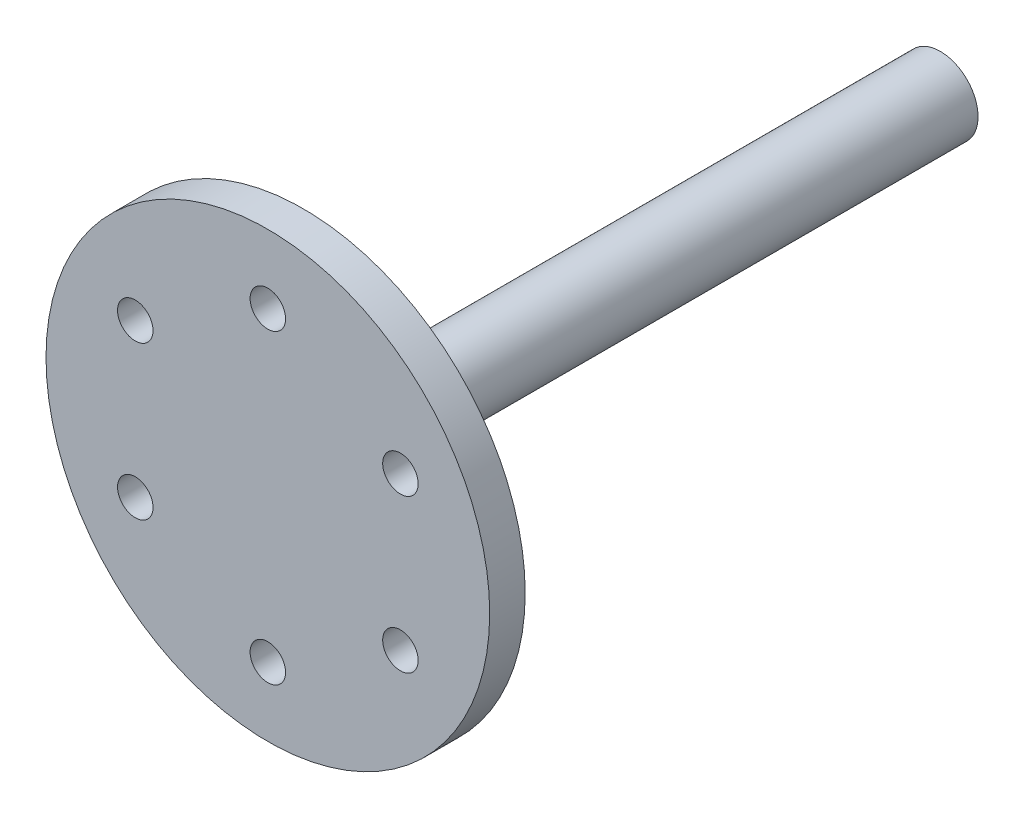
ISO-10303-21;
HEADER;
FILE_DESCRIPTION(('STEP AP214'),'2;1');
FILE_NAME('part.step','',(''),(''),'','','');
FILE_SCHEMA(('AUTOMOTIVE_DESIGN { 1 0 10303 214 1 1 1 1 }'));
ENDSEC;
DATA;
#1=APPLICATION_CONTEXT('core data for automotive mechanical design processes');
#2=APPLICATION_PROTOCOL_DEFINITION('international standard','automotive_design',2000,#1);
#3=PRODUCT_CONTEXT('',#1,'mechanical');
#4=PRODUCT('Part','Part','',(#3));
#5=PRODUCT_RELATED_PRODUCT_CATEGORY('part','',(#4));
#6=PRODUCT_DEFINITION_FORMATION('','',#4);
#7=PRODUCT_DEFINITION_CONTEXT('part definition',#1,'design');
#8=PRODUCT_DEFINITION('design','',#6,#7);
#9=PRODUCT_DEFINITION_SHAPE('','',#8);
#10=(LENGTH_UNIT() NAMED_UNIT(*) SI_UNIT(.MILLI.,.METRE.));
#11=(NAMED_UNIT(*) PLANE_ANGLE_UNIT() SI_UNIT($,.RADIAN.));
#12=(NAMED_UNIT(*) SI_UNIT($,.STERADIAN.) SOLID_ANGLE_UNIT());
#13=UNCERTAINTY_MEASURE_WITH_UNIT(LENGTH_MEASURE(1.E-05),#10,'distance_accuracy_value','');
#14=(GEOMETRIC_REPRESENTATION_CONTEXT(3) GLOBAL_UNCERTAINTY_ASSIGNED_CONTEXT((#13)) GLOBAL_UNIT_ASSIGNED_CONTEXT((#10,
#11,#12)) REPRESENTATION_CONTEXT('',''));
#15=CARTESIAN_POINT('',(0.,0.,0.));
#16=DIRECTION('',(0.,0.,1.));
#17=DIRECTION('',(1.,0.,0.));
#18=AXIS2_PLACEMENT_3D('',#15,#16,#17);
#19=CARTESIAN_POINT('',(0.,0.,4.));
#20=DIRECTION('',(0.,0.,-1.));
#21=DIRECTION('',(-1.,0.,0.));
#22=AXIS2_PLACEMENT_3D('',#19,#20,#21);
#23=CYLINDRICAL_SURFACE('',#22,25.);
#24=CARTESIAN_POINT('',(0.,0.,4.));
#25=DIRECTION('',(0.,0.,1.));
#26=DIRECTION('',(1.,0.,0.));
#27=AXIS2_PLACEMENT_3D('',#24,#25,#26);
#28=CIRCLE('',#27,25.);
#29=CARTESIAN_POINT('',(25.,0.,4.));
#30=VERTEX_POINT('',#29);
#31=EDGE_CURVE('E51',#30,#30,#28,.T.);
#32=ORIENTED_EDGE('',*,*,#31,.F.);
#33=EDGE_LOOP('',(#32));
#34=FACE_BOUND('',#33,.T.);
#35=CARTESIAN_POINT('',(0.,0.,0.));
#36=DIRECTION('',(0.,0.,1.));
#37=DIRECTION('',(1.,0.,0.));
#38=AXIS2_PLACEMENT_3D('',#35,#36,#37);
#39=CIRCLE('',#38,25.);
#40=CARTESIAN_POINT('',(25.,0.,0.));
#41=VERTEX_POINT('',#40);
#42=EDGE_CURVE('E46',#41,#41,#39,.T.);
#43=ORIENTED_EDGE('',*,*,#42,.T.);
#44=EDGE_LOOP('',(#43));
#45=FACE_BOUND('',#44,.T.);
#46=ADVANCED_FACE('F43',(#34,#45),#23,.T.);
#47=CARTESIAN_POINT('',(0.,0.,4.));
#48=DIRECTION('',(0.,0.,1.));
#49=DIRECTION('',(1.,0.,0.));
#50=AXIS2_PLACEMENT_3D('',#47,#48,#49);
#51=PLANE('',#50);
#52=CARTESIAN_POINT('',(0.,17.25,4.));
#53=DIRECTION('',(0.,0.,1.));
#54=DIRECTION('',(1.,0.,0.));
#55=AXIS2_PLACEMENT_3D('',#52,#53,#54);
#56=CIRCLE('',#55,2.);
#57=CARTESIAN_POINT('',(2.,17.25,4.));
#58=VERTEX_POINT('',#57);
#59=EDGE_CURVE('E62',#58,#58,#56,.T.);
#60=ORIENTED_EDGE('',*,*,#59,.F.);
#61=EDGE_LOOP('',(#60));
#62=FACE_BOUND('',#61,.T.);
#63=CARTESIAN_POINT('',(14.9389382152815,8.62500000000018,4.));
#64=DIRECTION('',(0.,0.,1.));
#65=DIRECTION('',(1.,0.,0.));
#66=AXIS2_PLACEMENT_3D('',#63,#64,#65);
#67=CIRCLE('',#66,2.);
#68=CARTESIAN_POINT('',(16.9389382152815,8.62500000000018,4.));
#69=VERTEX_POINT('',#68);
#70=EDGE_CURVE('E66',#69,#69,#67,.T.);
#71=ORIENTED_EDGE('',*,*,#70,.F.);
#72=EDGE_LOOP('',(#71));
#73=FACE_BOUND('',#72,.T.);
#74=CARTESIAN_POINT('',(14.9389382152816,-8.62499999999986,4.));
#75=DIRECTION('',(0.,0.,1.));
#76=DIRECTION('',(1.,0.,0.));
#77=AXIS2_PLACEMENT_3D('',#74,#75,#76);
#78=CIRCLE('',#77,2.);
#79=CARTESIAN_POINT('',(16.9389382152816,-8.62499999999986,4.));
#80=VERTEX_POINT('',#79);
#81=EDGE_CURVE('E70',#80,#80,#78,.T.);
#82=ORIENTED_EDGE('',*,*,#81,.F.);
#83=EDGE_LOOP('',(#82));
#84=FACE_BOUND('',#83,.T.);
#85=CARTESIAN_POINT('',(1.20456106190088E-13,-17.25,4.));
#86=DIRECTION('',(0.,0.,1.));
#87=DIRECTION('',(1.,0.,0.));
#88=AXIS2_PLACEMENT_3D('',#85,#86,#87);
#89=CIRCLE('',#88,2.);
#90=CARTESIAN_POINT('',(2.00000000000012,-17.25,4.));
#91=VERTEX_POINT('',#90);
#92=EDGE_CURVE('E74',#91,#91,#89,.T.);
#93=ORIENTED_EDGE('',*,*,#92,.F.);
#94=EDGE_LOOP('',(#93));
#95=FACE_BOUND('',#94,.T.);
#96=CARTESIAN_POINT('',(-14.9389382152815,-8.62500000000007,4.));
#97=DIRECTION('',(0.,0.,1.));
#98=DIRECTION('',(1.,0.,0.));
#99=AXIS2_PLACEMENT_3D('',#96,#97,#98);
#100=CIRCLE('',#99,2.);
#101=CARTESIAN_POINT('',(-12.9389382152815,-8.62500000000007,4.));
#102=VERTEX_POINT('',#101);
#103=EDGE_CURVE('E78',#102,#102,#100,.T.);
#104=ORIENTED_EDGE('',*,*,#103,.F.);
#105=EDGE_LOOP('',(#104));
#106=FACE_BOUND('',#105,.T.);
#107=CARTESIAN_POINT('',(-14.9389382152816,8.62499999999997,4.));
#108=DIRECTION('',(0.,0.,1.));
#109=DIRECTION('',(1.,0.,0.));
#110=AXIS2_PLACEMENT_3D('',#107,#108,#109);
#111=CIRCLE('',#110,2.);
#112=CARTESIAN_POINT('',(-12.9389382152816,8.62499999999997,4.));
#113=VERTEX_POINT('',#112);
#114=EDGE_CURVE('E82',#113,#113,#111,.T.);
#115=ORIENTED_EDGE('',*,*,#114,.F.);
#116=EDGE_LOOP('',(#115));
#117=FACE_BOUND('',#116,.T.);
#118=ORIENTED_EDGE('',*,*,#31,.T.);
#119=EDGE_LOOP('',(#118));
#120=FACE_BOUND('',#119,.T.);
#121=ADVANCED_FACE('F117',(#62,#73,#84,#95,#106,#117,#120),#51,.T.);
#122=CARTESIAN_POINT('',(0.,0.,0.));
#123=DIRECTION('',(0.,0.,1.));
#124=DIRECTION('',(1.,0.,0.));
#125=AXIS2_PLACEMENT_3D('',#122,#123,#124);
#126=PLANE('',#125);
#127=CARTESIAN_POINT('',(0.,17.25,0.));
#128=DIRECTION('',(0.,0.,-1.));
#129=DIRECTION('',(-1.,0.,0.));
#130=AXIS2_PLACEMENT_3D('',#127,#128,#129);
#131=CIRCLE('',#130,2.);
#132=CARTESIAN_POINT('',(-2.,17.25,0.));
#133=VERTEX_POINT('',#132);
#134=EDGE_CURVE('E86',#133,#133,#131,.T.);
#135=ORIENTED_EDGE('',*,*,#134,.F.);
#136=EDGE_LOOP('',(#135));
#137=FACE_BOUND('',#136,.T.);
#138=CARTESIAN_POINT('',(14.9389382152815,8.62500000000018,0.));
#139=DIRECTION('',(0.,0.,-1.));
#140=DIRECTION('',(-1.,0.,0.));
#141=AXIS2_PLACEMENT_3D('',#138,#139,#140);
#142=CIRCLE('',#141,2.);
#143=CARTESIAN_POINT('',(12.9389382152815,8.62500000000018,0.));
#144=VERTEX_POINT('',#143);
#145=EDGE_CURVE('E92',#144,#144,#142,.T.);
#146=ORIENTED_EDGE('',*,*,#145,.F.);
#147=EDGE_LOOP('',(#146));
#148=FACE_BOUND('',#147,.T.);
#149=CARTESIAN_POINT('',(14.9389382152816,-8.62499999999986,0.));
#150=DIRECTION('',(0.,0.,-1.));
#151=DIRECTION('',(-1.,0.,0.));
#152=AXIS2_PLACEMENT_3D('',#149,#150,#151);
#153=CIRCLE('',#152,2.);
#154=CARTESIAN_POINT('',(12.9389382152816,-8.62499999999986,0.));
#155=VERTEX_POINT('',#154);
#156=EDGE_CURVE('E87',#155,#155,#153,.T.);
#157=ORIENTED_EDGE('',*,*,#156,.F.);
#158=EDGE_LOOP('',(#157));
#159=FACE_BOUND('',#158,.T.);
#160=CARTESIAN_POINT('',(1.20456106190088E-13,-17.25,0.));
#161=DIRECTION('',(0.,0.,-1.));
#162=DIRECTION('',(-1.,0.,0.));
#163=AXIS2_PLACEMENT_3D('',#160,#161,#162);
#164=CIRCLE('',#163,2.);
#165=CARTESIAN_POINT('',(-1.99999999999988,-17.25,0.));
#166=VERTEX_POINT('',#165);
#167=EDGE_CURVE('E91',#166,#166,#164,.T.);
#168=ORIENTED_EDGE('',*,*,#167,.F.);
#169=EDGE_LOOP('',(#168));
#170=FACE_BOUND('',#169,.T.);
#171=CARTESIAN_POINT('',(-14.9389382152815,-8.62500000000007,0.));
#172=DIRECTION('',(0.,0.,-1.));
#173=DIRECTION('',(-1.,0.,0.));
#174=AXIS2_PLACEMENT_3D('',#171,#172,#173);
#175=CIRCLE('',#174,2.);
#176=CARTESIAN_POINT('',(-16.9389382152815,-8.62500000000007,0.));
#177=VERTEX_POINT('',#176);
#178=EDGE_CURVE('E96',#177,#177,#175,.T.);
#179=ORIENTED_EDGE('',*,*,#178,.F.);
#180=EDGE_LOOP('',(#179));
#181=FACE_BOUND('',#180,.T.);
#182=CARTESIAN_POINT('',(-14.9389382152816,8.62499999999997,0.));
#183=DIRECTION('',(0.,0.,-1.));
#184=DIRECTION('',(-1.,0.,0.));
#185=AXIS2_PLACEMENT_3D('',#182,#183,#184);
#186=CIRCLE('',#185,2.);
#187=CARTESIAN_POINT('',(-16.9389382152816,8.62499999999997,0.));
#188=VERTEX_POINT('',#187);
#189=EDGE_CURVE('E100',#188,#188,#186,.T.);
#190=ORIENTED_EDGE('',*,*,#189,.F.);
#191=EDGE_LOOP('',(#190));
#192=FACE_BOUND('',#191,.T.);
#193=CARTESIAN_POINT('',(-0.216871769754295,0.,0.));
#194=DIRECTION('',(0.,0.,-1.));
#195=DIRECTION('',(-1.,0.,0.));
#196=AXIS2_PLACEMENT_3D('',#193,#194,#195);
#197=CIRCLE('',#196,4.25);
#198=CARTESIAN_POINT('',(-4.4668717697543,0.,0.));
#199=VERTEX_POINT('',#198);
#200=EDGE_CURVE('E10',#199,#199,#197,.T.);
#201=ORIENTED_EDGE('',*,*,#200,.F.);
#202=EDGE_LOOP('',(#201));
#203=FACE_BOUND('',#202,.T.);
#204=ORIENTED_EDGE('',*,*,#42,.F.);
#205=EDGE_LOOP('',(#204));
#206=FACE_BOUND('',#205,.T.);
#207=ADVANCED_FACE('F113',(#137,#148,#159,#170,#181,#192,#203,#206),#126,.F.);
#208=CARTESIAN_POINT('',(-0.216871769754295,0.,-72.));
#209=DIRECTION('',(0.,0.,1.));
#210=DIRECTION('',(1.,0.,0.));
#211=AXIS2_PLACEMENT_3D('',#208,#209,#210);
#212=CYLINDRICAL_SURFACE('',#211,4.25);
#213=CARTESIAN_POINT('',(-0.216871769754295,0.,-72.));
#214=DIRECTION('',(0.,0.,-1.));
#215=DIRECTION('',(-1.,0.,0.));
#216=AXIS2_PLACEMENT_3D('',#213,#214,#215);
#217=CIRCLE('',#216,4.25);
#218=CARTESIAN_POINT('',(-4.4668717697543,0.,-72.));
#219=VERTEX_POINT('',#218);
#220=EDGE_CURVE('E58',#219,#219,#217,.T.);
#221=ORIENTED_EDGE('',*,*,#220,.F.);
#222=EDGE_LOOP('',(#221));
#223=FACE_BOUND('',#222,.T.);
#224=ORIENTED_EDGE('',*,*,#200,.T.);
#225=EDGE_LOOP('',(#224));
#226=FACE_BOUND('',#225,.T.);
#227=ADVANCED_FACE('F116',(#223,#226),#212,.T.);
#228=CARTESIAN_POINT('',(-0.216871769754295,0.,-72.));
#229=DIRECTION('',(0.,0.,-1.));
#230=DIRECTION('',(-1.,0.,0.));
#231=AXIS2_PLACEMENT_3D('',#228,#229,#230);
#232=PLANE('',#231);
#233=ORIENTED_EDGE('',*,*,#220,.T.);
#234=EDGE_LOOP('',(#233));
#235=FACE_BOUND('',#234,.T.);
#236=ADVANCED_FACE('F150',(#235),#232,.T.);
#237=CARTESIAN_POINT('',(-14.9389382152816,8.62499999999997,100.));
#238=DIRECTION('',(0.,0.,-1.));
#239=DIRECTION('',(-1.,0.,0.));
#240=AXIS2_PLACEMENT_3D('',#237,#238,#239);
#241=CYLINDRICAL_SURFACE('',#240,2.);
#242=ORIENTED_EDGE('',*,*,#114,.T.);
#243=EDGE_LOOP('',(#242));
#244=FACE_BOUND('',#243,.T.);
#245=ORIENTED_EDGE('',*,*,#189,.T.);
#246=EDGE_LOOP('',(#245));
#247=FACE_BOUND('',#246,.T.);
#248=ADVANCED_FACE('F153',(#244,#247),#241,.F.);
#249=CARTESIAN_POINT('',(-14.9389382152815,-8.62500000000007,100.));
#250=DIRECTION('',(0.,0.,-1.));
#251=DIRECTION('',(-1.,0.,0.));
#252=AXIS2_PLACEMENT_3D('',#249,#250,#251);
#253=CYLINDRICAL_SURFACE('',#252,2.);
#254=ORIENTED_EDGE('',*,*,#103,.T.);
#255=EDGE_LOOP('',(#254));
#256=FACE_BOUND('',#255,.T.);
#257=ORIENTED_EDGE('',*,*,#178,.T.);
#258=EDGE_LOOP('',(#257));
#259=FACE_BOUND('',#258,.T.);
#260=ADVANCED_FACE('F163',(#256,#259),#253,.F.);
#261=CARTESIAN_POINT('',(1.20456106190088E-13,-17.25,100.));
#262=DIRECTION('',(0.,0.,-1.));
#263=DIRECTION('',(-1.,0.,0.));
#264=AXIS2_PLACEMENT_3D('',#261,#262,#263);
#265=CYLINDRICAL_SURFACE('',#264,2.);
#266=ORIENTED_EDGE('',*,*,#92,.T.);
#267=EDGE_LOOP('',(#266));
#268=FACE_BOUND('',#267,.T.);
#269=ORIENTED_EDGE('',*,*,#167,.T.);
#270=EDGE_LOOP('',(#269));
#271=FACE_BOUND('',#270,.T.);
#272=ADVANCED_FACE('F159',(#268,#271),#265,.F.);
#273=CARTESIAN_POINT('',(14.9389382152816,-8.62499999999986,100.));
#274=DIRECTION('',(0.,0.,-1.));
#275=DIRECTION('',(-1.,0.,0.));
#276=AXIS2_PLACEMENT_3D('',#273,#274,#275);
#277=CYLINDRICAL_SURFACE('',#276,2.);
#278=ORIENTED_EDGE('',*,*,#81,.T.);
#279=EDGE_LOOP('',(#278));
#280=FACE_BOUND('',#279,.T.);
#281=ORIENTED_EDGE('',*,*,#156,.T.);
#282=EDGE_LOOP('',(#281));
#283=FACE_BOUND('',#282,.T.);
#284=ADVANCED_FACE('F155',(#280,#283),#277,.F.);
#285=CARTESIAN_POINT('',(14.9389382152815,8.62500000000018,100.));
#286=DIRECTION('',(0.,0.,-1.));
#287=DIRECTION('',(-1.,0.,0.));
#288=AXIS2_PLACEMENT_3D('',#285,#286,#287);
#289=CYLINDRICAL_SURFACE('',#288,2.);
#290=ORIENTED_EDGE('',*,*,#70,.T.);
#291=EDGE_LOOP('',(#290));
#292=FACE_BOUND('',#291,.T.);
#293=ORIENTED_EDGE('',*,*,#145,.T.);
#294=EDGE_LOOP('',(#293));
#295=FACE_BOUND('',#294,.T.);
#296=ADVANCED_FACE('F158',(#292,#295),#289,.F.);
#297=CARTESIAN_POINT('',(0.,17.25,100.));
#298=DIRECTION('',(0.,0.,-1.));
#299=DIRECTION('',(-1.,0.,0.));
#300=AXIS2_PLACEMENT_3D('',#297,#298,#299);
#301=CYLINDRICAL_SURFACE('',#300,2.);
#302=ORIENTED_EDGE('',*,*,#59,.T.);
#303=EDGE_LOOP('',(#302));
#304=FACE_BOUND('',#303,.T.);
#305=ORIENTED_EDGE('',*,*,#134,.T.);
#306=EDGE_LOOP('',(#305));
#307=FACE_BOUND('',#306,.T.);
#308=ADVANCED_FACE('F111',(#304,#307),#301,.F.);
#309=CLOSED_SHELL('',(#46,#121,#207,#227,#236,#248,#260,#272,#284,#296,#308));
#310=MANIFOLD_SOLID_BREP('B2',#309);
#311=ADVANCED_BREP_SHAPE_REPRESENTATION('',(#18,#310),#14);
#312=SHAPE_DEFINITION_REPRESENTATION(#9,#311);
ENDSEC;
END-ISO-10303-21;
